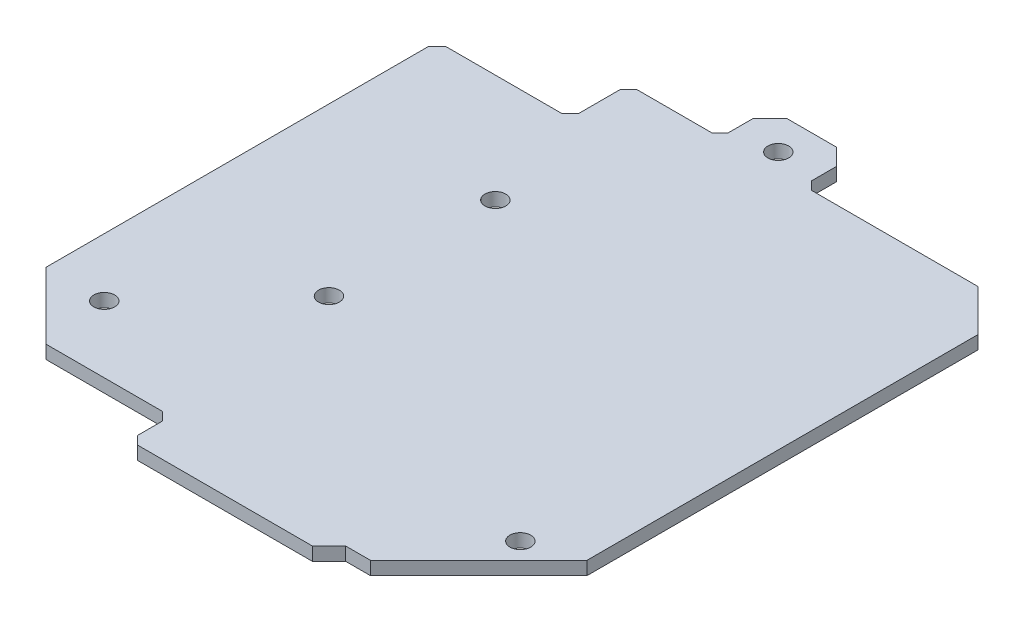
ISO-10303-21;
HEADER;
FILE_DESCRIPTION(('STEP AP214'),'2;1');
FILE_NAME('part.step','',(''),(''),'','','');
FILE_SCHEMA(('AUTOMOTIVE_DESIGN { 1 0 10303 214 1 1 1 1 }'));
ENDSEC;
DATA;
#1=APPLICATION_CONTEXT('core data for automotive mechanical design processes');
#2=APPLICATION_PROTOCOL_DEFINITION('international standard','automotive_design',2000,#1);
#3=PRODUCT_CONTEXT('',#1,'mechanical');
#4=PRODUCT('Part','Part','',(#3));
#5=PRODUCT_RELATED_PRODUCT_CATEGORY('part','',(#4));
#6=PRODUCT_DEFINITION_FORMATION('','',#4);
#7=PRODUCT_DEFINITION_CONTEXT('part definition',#1,'design');
#8=PRODUCT_DEFINITION('design','',#6,#7);
#9=PRODUCT_DEFINITION_SHAPE('','',#8);
#10=(LENGTH_UNIT() NAMED_UNIT(*) SI_UNIT(.MILLI.,.METRE.));
#11=(NAMED_UNIT(*) PLANE_ANGLE_UNIT() SI_UNIT($,.RADIAN.));
#12=(NAMED_UNIT(*) SI_UNIT($,.STERADIAN.) SOLID_ANGLE_UNIT());
#13=UNCERTAINTY_MEASURE_WITH_UNIT(LENGTH_MEASURE(1.E-05),#10,'distance_accuracy_value','');
#14=(GEOMETRIC_REPRESENTATION_CONTEXT(3) GLOBAL_UNCERTAINTY_ASSIGNED_CONTEXT((#13)) GLOBAL_UNIT_ASSIGNED_CONTEXT((#10,
#11,#12)) REPRESENTATION_CONTEXT('',''));
#15=CARTESIAN_POINT('',(0.,0.,0.));
#16=DIRECTION('',(0.,0.,1.));
#17=DIRECTION('',(1.,0.,0.));
#18=AXIS2_PLACEMENT_3D('',#15,#16,#17);
#19=CARTESIAN_POINT('',(0.,1.6,0.));
#20=DIRECTION('',(0.,1.,0.));
#21=DIRECTION('',(0.,0.,1.));
#22=AXIS2_PLACEMENT_3D('',#19,#20,#21);
#23=PLANE('',#22);
#24=CARTESIAN_POINT('',(-12.,1.6,-10.));
#25=DIRECTION('',(0.,1.,0.));
#26=DIRECTION('',(0.,0.,-1.));
#27=AXIS2_PLACEMENT_3D('',#24,#25,#26);
#28=CIRCLE('',#27,1.25);
#29=CARTESIAN_POINT('',(-12.,1.6,-11.25));
#30=VERTEX_POINT('',#29);
#31=EDGE_CURVE('E564',#30,#30,#28,.T.);
#32=ORIENTED_EDGE('',*,*,#31,.F.);
#33=EDGE_LOOP('',(#32));
#34=FACE_BOUND('',#33,.T.);
#35=CARTESIAN_POINT('',(25.,1.6,24.));
#36=DIRECTION('',(0.,1.,0.));
#37=DIRECTION('',(0.,0.,-1.));
#38=AXIS2_PLACEMENT_3D('',#35,#36,#37);
#39=CIRCLE('',#38,1.25);
#40=CARTESIAN_POINT('',(25.,1.6,22.75));
#41=VERTEX_POINT('',#40);
#42=EDGE_CURVE('E580',#41,#41,#39,.T.);
#43=ORIENTED_EDGE('',*,*,#42,.F.);
#44=EDGE_LOOP('',(#43));
#45=FACE_BOUND('',#44,.T.);
#46=DIRECTION('',(0.707106781186539,0.,0.707106781186556));
#47=VECTOR('',#46,1.);
#48=CARTESIAN_POINT('',(-32.,1.6,24.));
#49=LINE('',#48,#47);
#50=CARTESIAN_POINT('',(-32.,1.6,24.));
#51=VERTEX_POINT('',#50);
#52=CARTESIAN_POINT('',(-24.0000000000002,1.6,32.0000000000001));
#53=VERTEX_POINT('',#52);
#54=EDGE_CURVE('E330',#51,#53,#49,.T.);
#55=ORIENTED_EDGE('',*,*,#54,.T.);
#56=DIRECTION('',(1.,0.,0.));
#57=VECTOR('',#56,1.);
#58=CARTESIAN_POINT('',(-24.0000000000002,1.6,32.0000000000001));
#59=LINE('',#58,#57);
#60=CARTESIAN_POINT('',(-9.99999999999996,1.6,32.));
#61=VERTEX_POINT('',#60);
#62=EDGE_CURVE('E158',#53,#61,#59,.T.);
#63=ORIENTED_EDGE('',*,*,#62,.T.);
#64=DIRECTION('',(0.707106781186535,0.,0.70710678118656));
#65=VECTOR('',#64,1.);
#66=CARTESIAN_POINT('',(-9.99999999999996,1.6,32.));
#67=LINE('',#66,#65);
#68=CARTESIAN_POINT('',(-8.99999999999999,1.6,33.0000000000001));
#69=VERTEX_POINT('',#68);
#70=EDGE_CURVE('E423',#61,#69,#67,.T.);
#71=ORIENTED_EDGE('',*,*,#70,.T.);
#72=DIRECTION('',(0.,0.,1.));
#73=VECTOR('',#72,1.);
#74=CARTESIAN_POINT('',(-8.99999999999999,1.6,33.0000000000001));
#75=LINE('',#74,#73);
#76=CARTESIAN_POINT('',(-8.99999999999999,1.6,36.));
#77=VERTEX_POINT('',#76);
#78=EDGE_CURVE('E443',#69,#77,#75,.T.);
#79=ORIENTED_EDGE('',*,*,#78,.T.);
#80=DIRECTION('',(0.707106781186535,0.,0.70710678118656));
#81=VECTOR('',#80,1.);
#82=CARTESIAN_POINT('',(-8.99999999999999,1.6,36.));
#83=LINE('',#82,#81);
#84=CARTESIAN_POINT('',(-8.00000000000002,1.6,37.0000000000001));
#85=VERTEX_POINT('',#84);
#86=EDGE_CURVE('E439',#77,#85,#83,.T.);
#87=ORIENTED_EDGE('',*,*,#86,.T.);
#88=DIRECTION('',(1.,0.,0.));
#89=VECTOR('',#88,1.);
#90=CARTESIAN_POINT('',(-8.00000000000002,1.6,37.0000000000001));
#91=LINE('',#90,#89);
#92=CARTESIAN_POINT('',(13.,1.6,37.0000000000001));
#93=VERTEX_POINT('',#92);
#94=EDGE_CURVE('E442',#85,#93,#91,.T.);
#95=ORIENTED_EDGE('',*,*,#94,.T.);
#96=DIRECTION('',(0.707106781186556,0.,-0.707106781186539));
#97=VECTOR('',#96,1.);
#98=CARTESIAN_POINT('',(13.,1.6,37.0000000000001));
#99=LINE('',#98,#97);
#100=CARTESIAN_POINT('',(15.0000000000002,1.6,35.));
#101=VERTEX_POINT('',#100);
#102=EDGE_CURVE('E447',#93,#101,#99,.T.);
#103=ORIENTED_EDGE('',*,*,#102,.T.);
#104=DIRECTION('',(1.,0.,0.));
#105=VECTOR('',#104,1.);
#106=CARTESIAN_POINT('',(15.0000000000002,1.6,35.));
#107=LINE('',#106,#105);
#108=CARTESIAN_POINT('',(17.9999999999996,1.6,35.));
#109=VERTEX_POINT('',#108);
#110=EDGE_CURVE('E454',#101,#109,#107,.T.);
#111=ORIENTED_EDGE('',*,*,#110,.T.);
#112=DIRECTION('',(0.707106781186556,0.,-0.707106781186539));
#113=VECTOR('',#112,1.);
#114=CARTESIAN_POINT('',(17.9999999999996,1.6,35.));
#115=LINE('',#114,#113);
#116=CARTESIAN_POINT('',(30.9999999999999,1.6,22.));
#117=VERTEX_POINT('',#116);
#118=EDGE_CURVE('E457',#109,#117,#115,.T.);
#119=ORIENTED_EDGE('',*,*,#118,.T.);
#120=DIRECTION('',(0.,0.,-1.));
#121=VECTOR('',#120,1.);
#122=CARTESIAN_POINT('',(31.,1.6,-25.0000000000001));
#123=LINE('',#122,#121);
#124=CARTESIAN_POINT('',(31.,1.6,-25.0000000000001));
#125=VERTEX_POINT('',#124);
#126=EDGE_CURVE('E460',#117,#125,#123,.T.);
#127=ORIENTED_EDGE('',*,*,#126,.T.);
#128=DIRECTION('',(-0.707106781186553,0.,-0.707106781186542));
#129=VECTOR('',#128,1.);
#130=CARTESIAN_POINT('',(26.,1.6,-30.));
#131=LINE('',#130,#129);
#132=CARTESIAN_POINT('',(26.,1.6,-30.));
#133=VERTEX_POINT('',#132);
#134=EDGE_CURVE('E463',#125,#133,#131,.T.);
#135=ORIENTED_EDGE('',*,*,#134,.T.);
#136=DIRECTION('',(-1.,0.,0.));
#137=VECTOR('',#136,1.);
#138=CARTESIAN_POINT('',(6.,1.6,-30.));
#139=LINE('',#138,#137);
#140=CARTESIAN_POINT('',(6.,1.6,-30.));
#141=VERTEX_POINT('',#140);
#142=EDGE_CURVE('E466',#133,#141,#139,.T.);
#143=ORIENTED_EDGE('',*,*,#142,.T.);
#144=DIRECTION('',(-0.707106781186557,0.,-0.707106781186538));
#145=VECTOR('',#144,1.);
#146=CARTESIAN_POINT('',(5.,1.6,-31.));
#147=LINE('',#146,#145);
#148=CARTESIAN_POINT('',(5.,1.6,-31.));
#149=VERTEX_POINT('',#148);
#150=EDGE_CURVE('E469',#141,#149,#147,.T.);
#151=ORIENTED_EDGE('',*,*,#150,.T.);
#152=DIRECTION('',(0.,0.,-1.));
#153=VECTOR('',#152,1.);
#154=CARTESIAN_POINT('',(5.,1.6,-34.));
#155=LINE('',#154,#153);
#156=CARTESIAN_POINT('',(5.,1.6,-34.));
#157=VERTEX_POINT('',#156);
#158=EDGE_CURVE('E472',#149,#157,#155,.T.);
#159=ORIENTED_EDGE('',*,*,#158,.T.);
#160=DIRECTION('',(-0.70710678118655,0.,-0.707106781186545));
#161=VECTOR('',#160,1.);
#162=CARTESIAN_POINT('',(3.,1.6,-36.));
#163=LINE('',#162,#161);
#164=CARTESIAN_POINT('',(3.,1.6,-36.));
#165=VERTEX_POINT('',#164);
#166=EDGE_CURVE('E475',#157,#165,#163,.T.);
#167=ORIENTED_EDGE('',*,*,#166,.T.);
#168=DIRECTION('',(-1.,0.,0.));
#169=VECTOR('',#168,1.);
#170=CARTESIAN_POINT('',(-3.,1.6,-36.));
#171=LINE('',#170,#169);
#172=CARTESIAN_POINT('',(-3.,1.6,-36.));
#173=VERTEX_POINT('',#172);
#174=EDGE_CURVE('E478',#165,#173,#171,.T.);
#175=ORIENTED_EDGE('',*,*,#174,.T.);
#176=DIRECTION('',(-0.70710678118655,0.,0.707106781186545));
#177=VECTOR('',#176,1.);
#178=CARTESIAN_POINT('',(-3.,1.6,-36.));
#179=LINE('',#178,#177);
#180=CARTESIAN_POINT('',(-5.,1.6,-34.));
#181=VERTEX_POINT('',#180);
#182=EDGE_CURVE('E481',#173,#181,#179,.T.);
#183=ORIENTED_EDGE('',*,*,#182,.T.);
#184=DIRECTION('',(0.,0.,1.));
#185=VECTOR('',#184,1.);
#186=CARTESIAN_POINT('',(-5.,1.6,-34.));
#187=LINE('',#186,#185);
#188=CARTESIAN_POINT('',(-5.,1.6,-31.));
#189=VERTEX_POINT('',#188);
#190=EDGE_CURVE('E484',#181,#189,#187,.T.);
#191=ORIENTED_EDGE('',*,*,#190,.T.);
#192=DIRECTION('',(-0.707106781186556,0.,0.707106781186539));
#193=VECTOR('',#192,1.);
#194=CARTESIAN_POINT('',(-5.,1.6,-31.));
#195=LINE('',#194,#193);
#196=CARTESIAN_POINT('',(-6.,1.6,-30.));
#197=VERTEX_POINT('',#196);
#198=EDGE_CURVE('E487',#189,#197,#195,.T.);
#199=ORIENTED_EDGE('',*,*,#198,.T.);
#200=DIRECTION('',(-1.,0.,0.));
#201=VECTOR('',#200,1.);
#202=CARTESIAN_POINT('',(-6.,1.6,-30.));
#203=LINE('',#202,#201);
#204=CARTESIAN_POINT('',(-15.,1.6,-30.));
#205=VERTEX_POINT('',#204);
#206=EDGE_CURVE('E490',#197,#205,#203,.T.);
#207=ORIENTED_EDGE('',*,*,#206,.T.);
#208=DIRECTION('',(-0.707106781186556,0.,0.707106781186539));
#209=VECTOR('',#208,1.);
#210=CARTESIAN_POINT('',(-15.,1.6,-30.));
#211=LINE('',#210,#209);
#212=CARTESIAN_POINT('',(-16.,1.6,-29.));
#213=VERTEX_POINT('',#212);
#214=EDGE_CURVE('E493',#205,#213,#211,.T.);
#215=ORIENTED_EDGE('',*,*,#214,.T.);
#216=DIRECTION('',(0.,0.,1.));
#217=VECTOR('',#216,1.);
#218=CARTESIAN_POINT('',(-16.,1.6,-29.));
#219=LINE('',#218,#217);
#220=CARTESIAN_POINT('',(-16.,1.6,-24.));
#221=VERTEX_POINT('',#220);
#222=EDGE_CURVE('E496',#213,#221,#219,.T.);
#223=ORIENTED_EDGE('',*,*,#222,.T.);
#224=DIRECTION('',(-0.707106781186555,0.,0.70710678118654));
#225=VECTOR('',#224,1.);
#226=CARTESIAN_POINT('',(-16.,1.6,-24.));
#227=LINE('',#226,#225);
#228=CARTESIAN_POINT('',(-17.,1.6,-23.));
#229=VERTEX_POINT('',#228);
#230=EDGE_CURVE('E231',#221,#229,#227,.T.);
#231=ORIENTED_EDGE('',*,*,#230,.T.);
#232=DIRECTION('',(-1.,0.,0.));
#233=VECTOR('',#232,1.);
#234=CARTESIAN_POINT('',(-17.,1.6,-23.));
#235=LINE('',#234,#233);
#236=CARTESIAN_POINT('',(-31.,1.6,-22.9999999999999));
#237=VERTEX_POINT('',#236);
#238=EDGE_CURVE('E225',#229,#237,#235,.T.);
#239=ORIENTED_EDGE('',*,*,#238,.T.);
#240=DIRECTION('',(-0.707106781186556,0.,0.707106781186539));
#241=VECTOR('',#240,1.);
#242=CARTESIAN_POINT('',(-31.,1.6,-22.9999999999999));
#243=LINE('',#242,#241);
#244=CARTESIAN_POINT('',(-32.,1.6,-22.));
#245=VERTEX_POINT('',#244);
#246=EDGE_CURVE('E229',#237,#245,#243,.T.);
#247=ORIENTED_EDGE('',*,*,#246,.T.);
#248=DIRECTION('',(0.,0.,1.));
#249=VECTOR('',#248,1.);
#250=CARTESIAN_POINT('',(-32.,1.6,24.));
#251=LINE('',#250,#249);
#252=EDGE_CURVE('E61',#245,#51,#251,.T.);
#253=ORIENTED_EDGE('',*,*,#252,.T.);
#254=EDGE_LOOP('',(#55,#63,#71,#79,#87,#95,#103,#111,#119,#127,#135,#143,#151,#159,#167,#175,
#183,#191,#199,#207,#215,#223,#231,#239,#247,#253));
#255=FACE_BOUND('',#254,.T.);
#256=CARTESIAN_POINT('',(-25.,1.6,24.));
#257=DIRECTION('',(0.,1.,0.));
#258=DIRECTION('',(0.,0.,1.));
#259=AXIS2_PLACEMENT_3D('',#256,#257,#258);
#260=CIRCLE('',#259,1.25);
#261=CARTESIAN_POINT('',(-25.,1.6,25.25));
#262=VERTEX_POINT('',#261);
#263=EDGE_CURVE('E258',#262,#262,#260,.T.);
#264=ORIENTED_EDGE('',*,*,#263,.F.);
#265=EDGE_LOOP('',(#264));
#266=FACE_BOUND('',#265,.T.);
#267=CARTESIAN_POINT('',(0.,1.6,-32.));
#268=DIRECTION('',(0.,1.,0.));
#269=DIRECTION('',(0.,0.,1.));
#270=AXIS2_PLACEMENT_3D('',#267,#268,#269);
#271=CIRCLE('',#270,1.25);
#272=CARTESIAN_POINT('',(0.,1.6,-30.75));
#273=VERTEX_POINT('',#272);
#274=EDGE_CURVE('E572',#273,#273,#271,.T.);
#275=ORIENTED_EDGE('',*,*,#274,.F.);
#276=EDGE_LOOP('',(#275));
#277=FACE_BOUND('',#276,.T.);
#278=CARTESIAN_POINT('',(-12.,1.6,10.));
#279=DIRECTION('',(0.,1.,0.));
#280=DIRECTION('',(0.,0.,1.));
#281=AXIS2_PLACEMENT_3D('',#278,#279,#280);
#282=CIRCLE('',#281,1.25);
#283=CARTESIAN_POINT('',(-12.,1.6,11.25));
#284=VERTEX_POINT('',#283);
#285=EDGE_CURVE('E553',#284,#284,#282,.T.);
#286=ORIENTED_EDGE('',*,*,#285,.F.);
#287=EDGE_LOOP('',(#286));
#288=FACE_BOUND('',#287,.T.);
#289=ADVANCED_FACE('F43',(#34,#45,#255,#266,#277,#288),#23,.T.);
#290=CARTESIAN_POINT('',(0.,0.,0.));
#291=DIRECTION('',(0.,1.,0.));
#292=DIRECTION('',(0.,0.,1.));
#293=AXIS2_PLACEMENT_3D('',#290,#291,#292);
#294=PLANE('',#293);
#295=DIRECTION('',(0.707106781186539,0.,0.707106781186556));
#296=VECTOR('',#295,1.);
#297=CARTESIAN_POINT('',(-32.,0.,24.));
#298=LINE('',#297,#296);
#299=CARTESIAN_POINT('',(-32.,0.,24.));
#300=VERTEX_POINT('',#299);
#301=CARTESIAN_POINT('',(-24.0000000000002,0.,32.0000000000001));
#302=VERTEX_POINT('',#301);
#303=EDGE_CURVE('E253',#300,#302,#298,.T.);
#304=ORIENTED_EDGE('',*,*,#303,.F.);
#305=DIRECTION('',(0.,0.,1.));
#306=VECTOR('',#305,1.);
#307=CARTESIAN_POINT('',(-32.,0.,24.));
#308=LINE('',#307,#306);
#309=CARTESIAN_POINT('',(-32.,0.,-22.));
#310=VERTEX_POINT('',#309);
#311=EDGE_CURVE('E150',#310,#300,#308,.T.);
#312=ORIENTED_EDGE('',*,*,#311,.F.);
#313=DIRECTION('',(-0.707106781186556,0.,0.707106781186539));
#314=VECTOR('',#313,1.);
#315=CARTESIAN_POINT('',(-31.,0.,-22.9999999999999));
#316=LINE('',#315,#314);
#317=CARTESIAN_POINT('',(-31.,0.,-22.9999999999999));
#318=VERTEX_POINT('',#317);
#319=EDGE_CURVE('E144',#318,#310,#316,.T.);
#320=ORIENTED_EDGE('',*,*,#319,.F.);
#321=DIRECTION('',(-1.,0.,0.));
#322=VECTOR('',#321,1.);
#323=CARTESIAN_POINT('',(-17.,0.,-23.));
#324=LINE('',#323,#322);
#325=CARTESIAN_POINT('',(-17.,0.,-23.));
#326=VERTEX_POINT('',#325);
#327=EDGE_CURVE('E240',#326,#318,#324,.T.);
#328=ORIENTED_EDGE('',*,*,#327,.F.);
#329=DIRECTION('',(-0.707106781186555,0.,0.70710678118654));
#330=VECTOR('',#329,1.);
#331=CARTESIAN_POINT('',(-16.,0.,-24.));
#332=LINE('',#331,#330);
#333=CARTESIAN_POINT('',(-16.,0.,-24.));
#334=VERTEX_POINT('',#333);
#335=EDGE_CURVE('E321',#334,#326,#332,.T.);
#336=ORIENTED_EDGE('',*,*,#335,.F.);
#337=DIRECTION('',(0.,0.,1.));
#338=VECTOR('',#337,1.);
#339=CARTESIAN_POINT('',(-16.,0.,-29.));
#340=LINE('',#339,#338);
#341=CARTESIAN_POINT('',(-16.,0.,-29.));
#342=VERTEX_POINT('',#341);
#343=EDGE_CURVE('E318',#342,#334,#340,.T.);
#344=ORIENTED_EDGE('',*,*,#343,.F.);
#345=DIRECTION('',(-0.707106781186556,0.,0.707106781186539));
#346=VECTOR('',#345,1.);
#347=CARTESIAN_POINT('',(-15.,0.,-30.));
#348=LINE('',#347,#346);
#349=CARTESIAN_POINT('',(-15.,0.,-30.));
#350=VERTEX_POINT('',#349);
#351=EDGE_CURVE('E315',#350,#342,#348,.T.);
#352=ORIENTED_EDGE('',*,*,#351,.F.);
#353=DIRECTION('',(-1.,0.,0.));
#354=VECTOR('',#353,1.);
#355=CARTESIAN_POINT('',(-6.,0.,-30.));
#356=LINE('',#355,#354);
#357=CARTESIAN_POINT('',(-6.,0.,-30.));
#358=VERTEX_POINT('',#357);
#359=EDGE_CURVE('E312',#358,#350,#356,.T.);
#360=ORIENTED_EDGE('',*,*,#359,.F.);
#361=DIRECTION('',(-0.707106781186556,0.,0.707106781186539));
#362=VECTOR('',#361,1.);
#363=CARTESIAN_POINT('',(-5.,0.,-31.));
#364=LINE('',#363,#362);
#365=CARTESIAN_POINT('',(-5.,0.,-31.));
#366=VERTEX_POINT('',#365);
#367=EDGE_CURVE('E309',#366,#358,#364,.T.);
#368=ORIENTED_EDGE('',*,*,#367,.F.);
#369=DIRECTION('',(0.,0.,1.));
#370=VECTOR('',#369,1.);
#371=CARTESIAN_POINT('',(-5.,0.,-34.));
#372=LINE('',#371,#370);
#373=CARTESIAN_POINT('',(-5.,0.,-34.));
#374=VERTEX_POINT('',#373);
#375=EDGE_CURVE('E306',#374,#366,#372,.T.);
#376=ORIENTED_EDGE('',*,*,#375,.F.);
#377=DIRECTION('',(-0.70710678118655,0.,0.707106781186545));
#378=VECTOR('',#377,1.);
#379=CARTESIAN_POINT('',(-3.,0.,-36.));
#380=LINE('',#379,#378);
#381=CARTESIAN_POINT('',(-3.,0.,-36.));
#382=VERTEX_POINT('',#381);
#383=EDGE_CURVE('E303',#382,#374,#380,.T.);
#384=ORIENTED_EDGE('',*,*,#383,.F.);
#385=DIRECTION('',(-1.,0.,0.));
#386=VECTOR('',#385,1.);
#387=CARTESIAN_POINT('',(-3.,0.,-36.));
#388=LINE('',#387,#386);
#389=CARTESIAN_POINT('',(3.,0.,-36.));
#390=VERTEX_POINT('',#389);
#391=EDGE_CURVE('E300',#390,#382,#388,.T.);
#392=ORIENTED_EDGE('',*,*,#391,.F.);
#393=DIRECTION('',(-0.70710678118655,0.,-0.707106781186545));
#394=VECTOR('',#393,1.);
#395=CARTESIAN_POINT('',(3.,0.,-36.));
#396=LINE('',#395,#394);
#397=CARTESIAN_POINT('',(5.,0.,-34.));
#398=VERTEX_POINT('',#397);
#399=EDGE_CURVE('E297',#398,#390,#396,.T.);
#400=ORIENTED_EDGE('',*,*,#399,.F.);
#401=DIRECTION('',(0.,0.,-1.));
#402=VECTOR('',#401,1.);
#403=CARTESIAN_POINT('',(5.,0.,-34.));
#404=LINE('',#403,#402);
#405=CARTESIAN_POINT('',(5.,0.,-31.));
#406=VERTEX_POINT('',#405);
#407=EDGE_CURVE('E294',#406,#398,#404,.T.);
#408=ORIENTED_EDGE('',*,*,#407,.F.);
#409=DIRECTION('',(-0.707106781186557,0.,-0.707106781186538));
#410=VECTOR('',#409,1.);
#411=CARTESIAN_POINT('',(5.,0.,-31.));
#412=LINE('',#411,#410);
#413=CARTESIAN_POINT('',(6.,0.,-30.));
#414=VERTEX_POINT('',#413);
#415=EDGE_CURVE('E291',#414,#406,#412,.T.);
#416=ORIENTED_EDGE('',*,*,#415,.F.);
#417=DIRECTION('',(-1.,0.,0.));
#418=VECTOR('',#417,1.);
#419=CARTESIAN_POINT('',(6.,0.,-30.));
#420=LINE('',#419,#418);
#421=CARTESIAN_POINT('',(26.,0.,-30.));
#422=VERTEX_POINT('',#421);
#423=EDGE_CURVE('E288',#422,#414,#420,.T.);
#424=ORIENTED_EDGE('',*,*,#423,.F.);
#425=DIRECTION('',(-0.707106781186553,0.,-0.707106781186542));
#426=VECTOR('',#425,1.);
#427=CARTESIAN_POINT('',(26.,0.,-30.));
#428=LINE('',#427,#426);
#429=CARTESIAN_POINT('',(31.,0.,-25.0000000000001));
#430=VERTEX_POINT('',#429);
#431=EDGE_CURVE('E285',#430,#422,#428,.T.);
#432=ORIENTED_EDGE('',*,*,#431,.F.);
#433=DIRECTION('',(0.,0.,-1.));
#434=VECTOR('',#433,1.);
#435=CARTESIAN_POINT('',(31.,0.,-25.0000000000001));
#436=LINE('',#435,#434);
#437=CARTESIAN_POINT('',(30.9999999999999,0.,22.));
#438=VERTEX_POINT('',#437);
#439=EDGE_CURVE('E282',#438,#430,#436,.T.);
#440=ORIENTED_EDGE('',*,*,#439,.F.);
#441=DIRECTION('',(0.707106781186556,0.,-0.707106781186539));
#442=VECTOR('',#441,1.);
#443=CARTESIAN_POINT('',(17.9999999999996,0.,35.));
#444=LINE('',#443,#442);
#445=CARTESIAN_POINT('',(17.9999999999996,0.,35.));
#446=VERTEX_POINT('',#445);
#447=EDGE_CURVE('E279',#446,#438,#444,.T.);
#448=ORIENTED_EDGE('',*,*,#447,.F.);
#449=DIRECTION('',(1.,0.,0.));
#450=VECTOR('',#449,1.);
#451=CARTESIAN_POINT('',(15.0000000000002,0.,35.));
#452=LINE('',#451,#450);
#453=CARTESIAN_POINT('',(15.0000000000002,0.,35.));
#454=VERTEX_POINT('',#453);
#455=EDGE_CURVE('E276',#454,#446,#452,.T.);
#456=ORIENTED_EDGE('',*,*,#455,.F.);
#457=DIRECTION('',(0.707106781186556,0.,-0.707106781186539));
#458=VECTOR('',#457,1.);
#459=CARTESIAN_POINT('',(13.,0.,37.0000000000001));
#460=LINE('',#459,#458);
#461=CARTESIAN_POINT('',(13.,0.,37.0000000000001));
#462=VERTEX_POINT('',#461);
#463=EDGE_CURVE('E273',#462,#454,#460,.T.);
#464=ORIENTED_EDGE('',*,*,#463,.F.);
#465=DIRECTION('',(1.,0.,0.));
#466=VECTOR('',#465,1.);
#467=CARTESIAN_POINT('',(-8.00000000000002,0.,37.0000000000001));
#468=LINE('',#467,#466);
#469=CARTESIAN_POINT('',(-8.00000000000002,0.,37.0000000000001));
#470=VERTEX_POINT('',#469);
#471=EDGE_CURVE('E270',#470,#462,#468,.T.);
#472=ORIENTED_EDGE('',*,*,#471,.F.);
#473=DIRECTION('',(0.707106781186535,0.,0.70710678118656));
#474=VECTOR('',#473,1.);
#475=CARTESIAN_POINT('',(-8.99999999999999,0.,36.));
#476=LINE('',#475,#474);
#477=CARTESIAN_POINT('',(-8.99999999999999,0.,36.));
#478=VERTEX_POINT('',#477);
#479=EDGE_CURVE('E267',#478,#470,#476,.T.);
#480=ORIENTED_EDGE('',*,*,#479,.F.);
#481=DIRECTION('',(0.,0.,1.));
#482=VECTOR('',#481,1.);
#483=CARTESIAN_POINT('',(-8.99999999999999,0.,33.0000000000001));
#484=LINE('',#483,#482);
#485=CARTESIAN_POINT('',(-8.99999999999999,0.,33.0000000000001));
#486=VERTEX_POINT('',#485);
#487=EDGE_CURVE('E264',#486,#478,#484,.T.);
#488=ORIENTED_EDGE('',*,*,#487,.F.);
#489=DIRECTION('',(0.707106781186535,0.,0.70710678118656));
#490=VECTOR('',#489,1.);
#491=CARTESIAN_POINT('',(-9.99999999999996,0.,32.));
#492=LINE('',#491,#490);
#493=CARTESIAN_POINT('',(-9.99999999999996,0.,32.));
#494=VERTEX_POINT('',#493);
#495=EDGE_CURVE('E261',#494,#486,#492,.T.);
#496=ORIENTED_EDGE('',*,*,#495,.F.);
#497=DIRECTION('',(1.,0.,0.));
#498=VECTOR('',#497,1.);
#499=CARTESIAN_POINT('',(-24.0000000000002,0.,32.0000000000001));
#500=LINE('',#499,#498);
#501=EDGE_CURVE('E257',#302,#494,#500,.T.);
#502=ORIENTED_EDGE('',*,*,#501,.F.);
#503=EDGE_LOOP('',(#304,#312,#320,#328,#336,#344,#352,#360,#368,#376,#384,#392,#400,#408,#416,
#424,#432,#440,#448,#456,#464,#472,#480,#488,#496,#502));
#504=FACE_BOUND('',#503,.T.);
#505=CARTESIAN_POINT('',(-25.,0.,24.));
#506=DIRECTION('',(0.,1.,0.));
#507=DIRECTION('',(0.,0.,1.));
#508=AXIS2_PLACEMENT_3D('',#505,#506,#507);
#509=CIRCLE('',#508,1.25);
#510=CARTESIAN_POINT('',(-25.,0.,25.25));
#511=VERTEX_POINT('',#510);
#512=EDGE_CURVE('E584',#511,#511,#509,.T.);
#513=ORIENTED_EDGE('',*,*,#512,.T.);
#514=EDGE_LOOP('',(#513));
#515=FACE_BOUND('',#514,.T.);
#516=CARTESIAN_POINT('',(25.,0.,24.));
#517=DIRECTION('',(0.,1.,0.));
#518=DIRECTION('',(0.,0.,-1.));
#519=AXIS2_PLACEMENT_3D('',#516,#517,#518);
#520=CIRCLE('',#519,1.25);
#521=CARTESIAN_POINT('',(25.,0.,22.75));
#522=VERTEX_POINT('',#521);
#523=EDGE_CURVE('E576',#522,#522,#520,.T.);
#524=ORIENTED_EDGE('',*,*,#523,.T.);
#525=EDGE_LOOP('',(#524));
#526=FACE_BOUND('',#525,.T.);
#527=CARTESIAN_POINT('',(0.,0.,-32.));
#528=DIRECTION('',(0.,1.,0.));
#529=DIRECTION('',(0.,0.,1.));
#530=AXIS2_PLACEMENT_3D('',#527,#528,#529);
#531=CIRCLE('',#530,1.25);
#532=CARTESIAN_POINT('',(0.,0.,-30.75));
#533=VERTEX_POINT('',#532);
#534=EDGE_CURVE('E568',#533,#533,#531,.T.);
#535=ORIENTED_EDGE('',*,*,#534,.T.);
#536=EDGE_LOOP('',(#535));
#537=FACE_BOUND('',#536,.T.);
#538=CARTESIAN_POINT('',(-12.,0.,-10.));
#539=DIRECTION('',(0.,1.,0.));
#540=DIRECTION('',(0.,0.,-1.));
#541=AXIS2_PLACEMENT_3D('',#538,#539,#540);
#542=CIRCLE('',#541,1.25);
#543=CARTESIAN_POINT('',(-12.,0.,-11.25));
#544=VERTEX_POINT('',#543);
#545=EDGE_CURVE('E561',#544,#544,#542,.T.);
#546=ORIENTED_EDGE('',*,*,#545,.T.);
#547=EDGE_LOOP('',(#546));
#548=FACE_BOUND('',#547,.T.);
#549=CARTESIAN_POINT('',(-12.,0.,10.));
#550=DIRECTION('',(0.,1.,0.));
#551=DIRECTION('',(0.,0.,1.));
#552=AXIS2_PLACEMENT_3D('',#549,#550,#551);
#553=CIRCLE('',#552,1.25);
#554=CARTESIAN_POINT('',(-12.,0.,11.25));
#555=VERTEX_POINT('',#554);
#556=EDGE_CURVE('E556',#555,#555,#553,.T.);
#557=ORIENTED_EDGE('',*,*,#556,.T.);
#558=EDGE_LOOP('',(#557));
#559=FACE_BOUND('',#558,.T.);
#560=ADVANCED_FACE('F427',(#504,#515,#526,#537,#548,#559),#294,.F.);
#561=CARTESIAN_POINT('',(-32.,1.6,24.));
#562=DIRECTION('',(0.707106781186556,0.,-0.707106781186539));
#563=DIRECTION('',(-0.707106781186539,0.,-0.707106781186556));
#564=AXIS2_PLACEMENT_3D('',#561,#562,#563);
#565=PLANE('',#564);
#566=ORIENTED_EDGE('',*,*,#303,.T.);
#567=DIRECTION('',(0.,-1.,0.));
#568=VECTOR('',#567,1.);
#569=CARTESIAN_POINT('',(-24.0000000000002,1.6,32.0000000000001));
#570=LINE('',#569,#568);
#571=EDGE_CURVE('E11',#53,#302,#570,.T.);
#572=ORIENTED_EDGE('',*,*,#571,.F.);
#573=ORIENTED_EDGE('',*,*,#54,.F.);
#574=DIRECTION('',(0.,-1.,0.));
#575=VECTOR('',#574,1.);
#576=CARTESIAN_POINT('',(-32.,1.6,24.));
#577=LINE('',#576,#575);
#578=EDGE_CURVE('E249',#51,#300,#577,.T.);
#579=ORIENTED_EDGE('',*,*,#578,.T.);
#580=EDGE_LOOP('',(#566,#572,#573,#579));
#581=FACE_BOUND('',#580,.T.);
#582=ADVANCED_FACE('F45',(#581),#565,.F.);
#583=CARTESIAN_POINT('',(-24.0000000000002,1.6,32.0000000000001));
#584=DIRECTION('',(0.,0.,-1.));
#585=DIRECTION('',(-1.,0.,0.));
#586=AXIS2_PLACEMENT_3D('',#583,#584,#585);
#587=PLANE('',#586);
#588=ORIENTED_EDGE('',*,*,#501,.T.);
#589=DIRECTION('',(0.,-1.,0.));
#590=VECTOR('',#589,1.);
#591=CARTESIAN_POINT('',(-9.99999999999996,1.6,32.));
#592=LINE('',#591,#590);
#593=EDGE_CURVE('E53',#61,#494,#592,.T.);
#594=ORIENTED_EDGE('',*,*,#593,.F.);
#595=ORIENTED_EDGE('',*,*,#62,.F.);
#596=ORIENTED_EDGE('',*,*,#571,.T.);
#597=EDGE_LOOP('',(#588,#594,#595,#596));
#598=FACE_BOUND('',#597,.T.);
#599=ADVANCED_FACE('F873',(#598),#587,.F.);
#600=CARTESIAN_POINT('',(-9.99999999999996,1.6,32.));
#601=DIRECTION('',(0.70710678118656,0.,-0.707106781186535));
#602=DIRECTION('',(-0.707106781186535,0.,-0.70710678118656));
#603=AXIS2_PLACEMENT_3D('',#600,#601,#602);
#604=PLANE('',#603);
#605=ORIENTED_EDGE('',*,*,#495,.T.);
#606=DIRECTION('',(0.,-1.,0.));
#607=VECTOR('',#606,1.);
#608=CARTESIAN_POINT('',(-8.99999999999999,1.6,33.0000000000001));
#609=LINE('',#608,#607);
#610=EDGE_CURVE('E413',#69,#486,#609,.T.);
#611=ORIENTED_EDGE('',*,*,#610,.F.);
#612=ORIENTED_EDGE('',*,*,#70,.F.);
#613=ORIENTED_EDGE('',*,*,#593,.T.);
#614=EDGE_LOOP('',(#605,#611,#612,#613));
#615=FACE_BOUND('',#614,.T.);
#616=ADVANCED_FACE('F421',(#615),#604,.F.);
#617=CARTESIAN_POINT('',(-8.99999999999999,1.6,33.0000000000001));
#618=DIRECTION('',(1.,0.,0.));
#619=DIRECTION('',(0.,0.,-1.));
#620=AXIS2_PLACEMENT_3D('',#617,#618,#619);
#621=PLANE('',#620);
#622=ORIENTED_EDGE('',*,*,#487,.T.);
#623=DIRECTION('',(0.,-1.,0.));
#624=VECTOR('',#623,1.);
#625=CARTESIAN_POINT('',(-8.99999999999999,1.6,36.));
#626=LINE('',#625,#624);
#627=EDGE_CURVE('E409',#77,#478,#626,.T.);
#628=ORIENTED_EDGE('',*,*,#627,.F.);
#629=ORIENTED_EDGE('',*,*,#78,.F.);
#630=ORIENTED_EDGE('',*,*,#610,.T.);
#631=EDGE_LOOP('',(#622,#628,#629,#630));
#632=FACE_BOUND('',#631,.T.);
#633=ADVANCED_FACE('F433',(#632),#621,.F.);
#634=CARTESIAN_POINT('',(-8.99999999999999,1.6,36.));
#635=DIRECTION('',(0.70710678118656,0.,-0.707106781186535));
#636=DIRECTION('',(-0.707106781186535,0.,-0.70710678118656));
#637=AXIS2_PLACEMENT_3D('',#634,#635,#636);
#638=PLANE('',#637);
#639=ORIENTED_EDGE('',*,*,#479,.T.);
#640=DIRECTION('',(0.,-1.,0.));
#641=VECTOR('',#640,1.);
#642=CARTESIAN_POINT('',(-8.00000000000002,1.6,37.0000000000001));
#643=LINE('',#642,#641);
#644=EDGE_CURVE('E405',#85,#470,#643,.T.);
#645=ORIENTED_EDGE('',*,*,#644,.F.);
#646=ORIENTED_EDGE('',*,*,#86,.F.);
#647=ORIENTED_EDGE('',*,*,#627,.T.);
#648=EDGE_LOOP('',(#639,#645,#646,#647));
#649=FACE_BOUND('',#648,.T.);
#650=ADVANCED_FACE('F437',(#649),#638,.F.);
#651=CARTESIAN_POINT('',(-8.00000000000002,1.6,37.0000000000001));
#652=DIRECTION('',(0.,0.,-1.));
#653=DIRECTION('',(-1.,0.,0.));
#654=AXIS2_PLACEMENT_3D('',#651,#652,#653);
#655=PLANE('',#654);
#656=ORIENTED_EDGE('',*,*,#471,.T.);
#657=DIRECTION('',(0.,-1.,0.));
#658=VECTOR('',#657,1.);
#659=CARTESIAN_POINT('',(13.,1.6,37.0000000000001));
#660=LINE('',#659,#658);
#661=EDGE_CURVE('E401',#93,#462,#660,.T.);
#662=ORIENTED_EDGE('',*,*,#661,.F.);
#663=ORIENTED_EDGE('',*,*,#94,.F.);
#664=ORIENTED_EDGE('',*,*,#644,.T.);
#665=EDGE_LOOP('',(#656,#662,#663,#664));
#666=FACE_BOUND('',#665,.T.);
#667=ADVANCED_FACE('F834',(#666),#655,.F.);
#668=CARTESIAN_POINT('',(13.,1.6,37.0000000000001));
#669=DIRECTION('',(-0.707106781186539,0.,-0.707106781186556));
#670=DIRECTION('',(-0.707106781186556,0.,0.707106781186539));
#671=AXIS2_PLACEMENT_3D('',#668,#669,#670);
#672=PLANE('',#671);
#673=ORIENTED_EDGE('',*,*,#463,.T.);
#674=DIRECTION('',(0.,-1.,0.));
#675=VECTOR('',#674,1.);
#676=CARTESIAN_POINT('',(15.0000000000002,1.6,35.));
#677=LINE('',#676,#675);
#678=EDGE_CURVE('E397',#101,#454,#677,.T.);
#679=ORIENTED_EDGE('',*,*,#678,.F.);
#680=ORIENTED_EDGE('',*,*,#102,.F.);
#681=ORIENTED_EDGE('',*,*,#661,.T.);
#682=EDGE_LOOP('',(#673,#679,#680,#681));
#683=FACE_BOUND('',#682,.T.);
#684=ADVANCED_FACE('F823',(#683),#672,.F.);
#685=CARTESIAN_POINT('',(15.0000000000002,1.6,35.));
#686=DIRECTION('',(0.,0.,-1.));
#687=DIRECTION('',(-1.,0.,0.));
#688=AXIS2_PLACEMENT_3D('',#685,#686,#687);
#689=PLANE('',#688);
#690=ORIENTED_EDGE('',*,*,#455,.T.);
#691=DIRECTION('',(0.,-1.,0.));
#692=VECTOR('',#691,1.);
#693=CARTESIAN_POINT('',(17.9999999999996,1.6,35.));
#694=LINE('',#693,#692);
#695=EDGE_CURVE('E393',#109,#446,#694,.T.);
#696=ORIENTED_EDGE('',*,*,#695,.F.);
#697=ORIENTED_EDGE('',*,*,#110,.F.);
#698=ORIENTED_EDGE('',*,*,#678,.T.);
#699=EDGE_LOOP('',(#690,#696,#697,#698));
#700=FACE_BOUND('',#699,.T.);
#701=ADVANCED_FACE('F812',(#700),#689,.F.);
#702=CARTESIAN_POINT('',(17.9999999999996,1.6,35.));
#703=DIRECTION('',(-0.707106781186539,0.,-0.707106781186556));
#704=DIRECTION('',(-0.707106781186556,0.,0.707106781186539));
#705=AXIS2_PLACEMENT_3D('',#702,#703,#704);
#706=PLANE('',#705);
#707=ORIENTED_EDGE('',*,*,#447,.T.);
#708=DIRECTION('',(0.,-1.,0.));
#709=VECTOR('',#708,1.);
#710=CARTESIAN_POINT('',(30.9999999999999,1.6,22.));
#711=LINE('',#710,#709);
#712=EDGE_CURVE('E389',#117,#438,#711,.T.);
#713=ORIENTED_EDGE('',*,*,#712,.F.);
#714=ORIENTED_EDGE('',*,*,#118,.F.);
#715=ORIENTED_EDGE('',*,*,#695,.T.);
#716=EDGE_LOOP('',(#707,#713,#714,#715));
#717=FACE_BOUND('',#716,.T.);
#718=ADVANCED_FACE('F801',(#717),#706,.F.);
#719=CARTESIAN_POINT('',(31.,1.6,-25.0000000000001));
#720=DIRECTION('',(-1.,0.,0.));
#721=DIRECTION('',(0.,0.,1.));
#722=AXIS2_PLACEMENT_3D('',#719,#720,#721);
#723=PLANE('',#722);
#724=ORIENTED_EDGE('',*,*,#439,.T.);
#725=DIRECTION('',(0.,-1.,0.));
#726=VECTOR('',#725,1.);
#727=CARTESIAN_POINT('',(31.,1.6,-25.0000000000001));
#728=LINE('',#727,#726);
#729=EDGE_CURVE('E385',#125,#430,#728,.T.);
#730=ORIENTED_EDGE('',*,*,#729,.F.);
#731=ORIENTED_EDGE('',*,*,#126,.F.);
#732=ORIENTED_EDGE('',*,*,#712,.T.);
#733=EDGE_LOOP('',(#724,#730,#731,#732));
#734=FACE_BOUND('',#733,.T.);
#735=ADVANCED_FACE('F790',(#734),#723,.F.);
#736=CARTESIAN_POINT('',(26.,1.6,-30.));
#737=DIRECTION('',(-0.707106781186542,0.,0.707106781186553));
#738=DIRECTION('',(0.707106781186553,0.,0.707106781186542));
#739=AXIS2_PLACEMENT_3D('',#736,#737,#738);
#740=PLANE('',#739);
#741=ORIENTED_EDGE('',*,*,#431,.T.);
#742=DIRECTION('',(0.,-1.,0.));
#743=VECTOR('',#742,1.);
#744=CARTESIAN_POINT('',(26.,1.6,-30.));
#745=LINE('',#744,#743);
#746=EDGE_CURVE('E381',#133,#422,#745,.T.);
#747=ORIENTED_EDGE('',*,*,#746,.F.);
#748=ORIENTED_EDGE('',*,*,#134,.F.);
#749=ORIENTED_EDGE('',*,*,#729,.T.);
#750=EDGE_LOOP('',(#741,#747,#748,#749));
#751=FACE_BOUND('',#750,.T.);
#752=ADVANCED_FACE('F779',(#751),#740,.F.);
#753=CARTESIAN_POINT('',(6.,1.6,-30.));
#754=DIRECTION('',(0.,0.,1.));
#755=DIRECTION('',(1.,0.,0.));
#756=AXIS2_PLACEMENT_3D('',#753,#754,#755);
#757=PLANE('',#756);
#758=ORIENTED_EDGE('',*,*,#423,.T.);
#759=DIRECTION('',(0.,-1.,0.));
#760=VECTOR('',#759,1.);
#761=CARTESIAN_POINT('',(6.,1.6,-30.));
#762=LINE('',#761,#760);
#763=EDGE_CURVE('E377',#141,#414,#762,.T.);
#764=ORIENTED_EDGE('',*,*,#763,.F.);
#765=ORIENTED_EDGE('',*,*,#142,.F.);
#766=ORIENTED_EDGE('',*,*,#746,.T.);
#767=EDGE_LOOP('',(#758,#764,#765,#766));
#768=FACE_BOUND('',#767,.T.);
#769=ADVANCED_FACE('F768',(#768),#757,.F.);
#770=CARTESIAN_POINT('',(5.,1.6,-31.));
#771=DIRECTION('',(-0.707106781186538,0.,0.707106781186557));
#772=DIRECTION('',(0.707106781186557,0.,0.707106781186538));
#773=AXIS2_PLACEMENT_3D('',#770,#771,#772);
#774=PLANE('',#773);
#775=ORIENTED_EDGE('',*,*,#415,.T.);
#776=DIRECTION('',(0.,-1.,0.));
#777=VECTOR('',#776,1.);
#778=CARTESIAN_POINT('',(5.,1.6,-31.));
#779=LINE('',#778,#777);
#780=EDGE_CURVE('E373',#149,#406,#779,.T.);
#781=ORIENTED_EDGE('',*,*,#780,.F.);
#782=ORIENTED_EDGE('',*,*,#150,.F.);
#783=ORIENTED_EDGE('',*,*,#763,.T.);
#784=EDGE_LOOP('',(#775,#781,#782,#783));
#785=FACE_BOUND('',#784,.T.);
#786=ADVANCED_FACE('F757',(#785),#774,.F.);
#787=CARTESIAN_POINT('',(5.,1.6,-34.));
#788=DIRECTION('',(-1.,0.,0.));
#789=DIRECTION('',(0.,0.,1.));
#790=AXIS2_PLACEMENT_3D('',#787,#788,#789);
#791=PLANE('',#790);
#792=ORIENTED_EDGE('',*,*,#407,.T.);
#793=DIRECTION('',(0.,-1.,0.));
#794=VECTOR('',#793,1.);
#795=CARTESIAN_POINT('',(5.,1.6,-34.));
#796=LINE('',#795,#794);
#797=EDGE_CURVE('E369',#157,#398,#796,.T.);
#798=ORIENTED_EDGE('',*,*,#797,.F.);
#799=ORIENTED_EDGE('',*,*,#158,.F.);
#800=ORIENTED_EDGE('',*,*,#780,.T.);
#801=EDGE_LOOP('',(#792,#798,#799,#800));
#802=FACE_BOUND('',#801,.T.);
#803=ADVANCED_FACE('F746',(#802),#791,.F.);
#804=CARTESIAN_POINT('',(3.,1.6,-36.));
#805=DIRECTION('',(-0.707106781186545,0.,0.70710678118655));
#806=DIRECTION('',(0.70710678118655,0.,0.707106781186545));
#807=AXIS2_PLACEMENT_3D('',#804,#805,#806);
#808=PLANE('',#807);
#809=ORIENTED_EDGE('',*,*,#399,.T.);
#810=DIRECTION('',(0.,-1.,0.));
#811=VECTOR('',#810,1.);
#812=CARTESIAN_POINT('',(3.,1.6,-36.));
#813=LINE('',#812,#811);
#814=EDGE_CURVE('E365',#165,#390,#813,.T.);
#815=ORIENTED_EDGE('',*,*,#814,.F.);
#816=ORIENTED_EDGE('',*,*,#166,.F.);
#817=ORIENTED_EDGE('',*,*,#797,.T.);
#818=EDGE_LOOP('',(#809,#815,#816,#817));
#819=FACE_BOUND('',#818,.T.);
#820=ADVANCED_FACE('F735',(#819),#808,.F.);
#821=CARTESIAN_POINT('',(-3.,1.6,-36.));
#822=DIRECTION('',(0.,0.,1.));
#823=DIRECTION('',(1.,0.,0.));
#824=AXIS2_PLACEMENT_3D('',#821,#822,#823);
#825=PLANE('',#824);
#826=ORIENTED_EDGE('',*,*,#391,.T.);
#827=DIRECTION('',(0.,-1.,0.));
#828=VECTOR('',#827,1.);
#829=CARTESIAN_POINT('',(-3.,1.6,-36.));
#830=LINE('',#829,#828);
#831=EDGE_CURVE('E361',#173,#382,#830,.T.);
#832=ORIENTED_EDGE('',*,*,#831,.F.);
#833=ORIENTED_EDGE('',*,*,#174,.F.);
#834=ORIENTED_EDGE('',*,*,#814,.T.);
#835=EDGE_LOOP('',(#826,#832,#833,#834));
#836=FACE_BOUND('',#835,.T.);
#837=ADVANCED_FACE('F724',(#836),#825,.F.);
#838=CARTESIAN_POINT('',(-3.,1.6,-36.));
#839=DIRECTION('',(0.707106781186545,0.,0.70710678118655));
#840=DIRECTION('',(0.70710678118655,0.,-0.707106781186545));
#841=AXIS2_PLACEMENT_3D('',#838,#839,#840);
#842=PLANE('',#841);
#843=ORIENTED_EDGE('',*,*,#383,.T.);
#844=DIRECTION('',(0.,-1.,0.));
#845=VECTOR('',#844,1.);
#846=CARTESIAN_POINT('',(-5.,1.6,-34.));
#847=LINE('',#846,#845);
#848=EDGE_CURVE('E357',#181,#374,#847,.T.);
#849=ORIENTED_EDGE('',*,*,#848,.F.);
#850=ORIENTED_EDGE('',*,*,#182,.F.);
#851=ORIENTED_EDGE('',*,*,#831,.T.);
#852=EDGE_LOOP('',(#843,#849,#850,#851));
#853=FACE_BOUND('',#852,.T.);
#854=ADVANCED_FACE('F713',(#853),#842,.F.);
#855=CARTESIAN_POINT('',(-5.,1.6,-34.));
#856=DIRECTION('',(1.,0.,0.));
#857=DIRECTION('',(0.,0.,-1.));
#858=AXIS2_PLACEMENT_3D('',#855,#856,#857);
#859=PLANE('',#858);
#860=ORIENTED_EDGE('',*,*,#375,.T.);
#861=DIRECTION('',(0.,-1.,0.));
#862=VECTOR('',#861,1.);
#863=CARTESIAN_POINT('',(-5.,1.6,-31.));
#864=LINE('',#863,#862);
#865=EDGE_CURVE('E353',#189,#366,#864,.T.);
#866=ORIENTED_EDGE('',*,*,#865,.F.);
#867=ORIENTED_EDGE('',*,*,#190,.F.);
#868=ORIENTED_EDGE('',*,*,#848,.T.);
#869=EDGE_LOOP('',(#860,#866,#867,#868));
#870=FACE_BOUND('',#869,.T.);
#871=ADVANCED_FACE('F702',(#870),#859,.F.);
#872=CARTESIAN_POINT('',(-5.,1.6,-31.));
#873=DIRECTION('',(0.707106781186539,0.,0.707106781186556));
#874=DIRECTION('',(0.707106781186556,0.,-0.707106781186539));
#875=AXIS2_PLACEMENT_3D('',#872,#873,#874);
#876=PLANE('',#875);
#877=ORIENTED_EDGE('',*,*,#367,.T.);
#878=DIRECTION('',(0.,-1.,0.));
#879=VECTOR('',#878,1.);
#880=CARTESIAN_POINT('',(-6.,1.6,-30.));
#881=LINE('',#880,#879);
#882=EDGE_CURVE('E349',#197,#358,#881,.T.);
#883=ORIENTED_EDGE('',*,*,#882,.F.);
#884=ORIENTED_EDGE('',*,*,#198,.F.);
#885=ORIENTED_EDGE('',*,*,#865,.T.);
#886=EDGE_LOOP('',(#877,#883,#884,#885));
#887=FACE_BOUND('',#886,.T.);
#888=ADVANCED_FACE('F691',(#887),#876,.F.);
#889=CARTESIAN_POINT('',(-6.,1.6,-30.));
#890=DIRECTION('',(0.,0.,1.));
#891=DIRECTION('',(1.,0.,0.));
#892=AXIS2_PLACEMENT_3D('',#889,#890,#891);
#893=PLANE('',#892);
#894=ORIENTED_EDGE('',*,*,#359,.T.);
#895=DIRECTION('',(0.,-1.,0.));
#896=VECTOR('',#895,1.);
#897=CARTESIAN_POINT('',(-15.,1.6,-30.));
#898=LINE('',#897,#896);
#899=EDGE_CURVE('E345',#205,#350,#898,.T.);
#900=ORIENTED_EDGE('',*,*,#899,.F.);
#901=ORIENTED_EDGE('',*,*,#206,.F.);
#902=ORIENTED_EDGE('',*,*,#882,.T.);
#903=EDGE_LOOP('',(#894,#900,#901,#902));
#904=FACE_BOUND('',#903,.T.);
#905=ADVANCED_FACE('F680',(#904),#893,.F.);
#906=CARTESIAN_POINT('',(-15.,1.6,-30.));
#907=DIRECTION('',(0.707106781186539,0.,0.707106781186556));
#908=DIRECTION('',(0.707106781186556,0.,-0.707106781186539));
#909=AXIS2_PLACEMENT_3D('',#906,#907,#908);
#910=PLANE('',#909);
#911=ORIENTED_EDGE('',*,*,#351,.T.);
#912=DIRECTION('',(0.,-1.,0.));
#913=VECTOR('',#912,1.);
#914=CARTESIAN_POINT('',(-16.,1.6,-29.));
#915=LINE('',#914,#913);
#916=EDGE_CURVE('E341',#213,#342,#915,.T.);
#917=ORIENTED_EDGE('',*,*,#916,.F.);
#918=ORIENTED_EDGE('',*,*,#214,.F.);
#919=ORIENTED_EDGE('',*,*,#899,.T.);
#920=EDGE_LOOP('',(#911,#917,#918,#919));
#921=FACE_BOUND('',#920,.T.);
#922=ADVANCED_FACE('F670',(#921),#910,.F.);
#923=CARTESIAN_POINT('',(-16.,1.6,-29.));
#924=DIRECTION('',(1.,0.,0.));
#925=DIRECTION('',(0.,0.,-1.));
#926=AXIS2_PLACEMENT_3D('',#923,#924,#925);
#927=PLANE('',#926);
#928=ORIENTED_EDGE('',*,*,#343,.T.);
#929=DIRECTION('',(0.,-1.,0.));
#930=VECTOR('',#929,1.);
#931=CARTESIAN_POINT('',(-16.,1.6,-24.));
#932=LINE('',#931,#930);
#933=EDGE_CURVE('E337',#221,#334,#932,.T.);
#934=ORIENTED_EDGE('',*,*,#933,.F.);
#935=ORIENTED_EDGE('',*,*,#222,.F.);
#936=ORIENTED_EDGE('',*,*,#916,.T.);
#937=EDGE_LOOP('',(#928,#934,#935,#936));
#938=FACE_BOUND('',#937,.T.);
#939=ADVANCED_FACE('F504',(#938),#927,.F.);
#940=CARTESIAN_POINT('',(-16.,1.6,-24.));
#941=DIRECTION('',(0.70710678118654,0.,0.707106781186555));
#942=DIRECTION('',(0.707106781186555,0.,-0.70710678118654));
#943=AXIS2_PLACEMENT_3D('',#940,#941,#942);
#944=PLANE('',#943);
#945=ORIENTED_EDGE('',*,*,#335,.T.);
#946=DIRECTION('',(0.,-1.,0.));
#947=VECTOR('',#946,1.);
#948=CARTESIAN_POINT('',(-17.,1.6,-23.));
#949=LINE('',#948,#947);
#950=EDGE_CURVE('E242',#229,#326,#949,.T.);
#951=ORIENTED_EDGE('',*,*,#950,.F.);
#952=ORIENTED_EDGE('',*,*,#230,.F.);
#953=ORIENTED_EDGE('',*,*,#933,.T.);
#954=EDGE_LOOP('',(#945,#951,#952,#953));
#955=FACE_BOUND('',#954,.T.);
#956=ADVANCED_FACE('F508',(#955),#944,.F.);
#957=CARTESIAN_POINT('',(-17.,1.6,-23.));
#958=DIRECTION('',(0.,0.,1.));
#959=DIRECTION('',(1.,0.,0.));
#960=AXIS2_PLACEMENT_3D('',#957,#958,#959);
#961=PLANE('',#960);
#962=ORIENTED_EDGE('',*,*,#327,.T.);
#963=DIRECTION('',(0.,-1.,0.));
#964=VECTOR('',#963,1.);
#965=CARTESIAN_POINT('',(-31.,1.6,-22.9999999999999));
#966=LINE('',#965,#964);
#967=EDGE_CURVE('E237',#237,#318,#966,.T.);
#968=ORIENTED_EDGE('',*,*,#967,.F.);
#969=ORIENTED_EDGE('',*,*,#238,.F.);
#970=ORIENTED_EDGE('',*,*,#950,.T.);
#971=EDGE_LOOP('',(#962,#968,#969,#970));
#972=FACE_BOUND('',#971,.T.);
#973=ADVANCED_FACE('F238',(#972),#961,.F.);
#974=CARTESIAN_POINT('',(-31.,1.6,-22.9999999999999));
#975=DIRECTION('',(0.707106781186539,0.,0.707106781186556));
#976=DIRECTION('',(0.707106781186556,0.,-0.707106781186539));
#977=AXIS2_PLACEMENT_3D('',#974,#975,#976);
#978=PLANE('',#977);
#979=ORIENTED_EDGE('',*,*,#319,.T.);
#980=DIRECTION('',(0.,-1.,0.));
#981=VECTOR('',#980,1.);
#982=CARTESIAN_POINT('',(-32.,1.6,-22.));
#983=LINE('',#982,#981);
#984=EDGE_CURVE('E243',#245,#310,#983,.T.);
#985=ORIENTED_EDGE('',*,*,#984,.F.);
#986=ORIENTED_EDGE('',*,*,#246,.F.);
#987=ORIENTED_EDGE('',*,*,#967,.T.);
#988=EDGE_LOOP('',(#979,#985,#986,#987));
#989=FACE_BOUND('',#988,.T.);
#990=ADVANCED_FACE('F245',(#989),#978,.F.);
#991=CARTESIAN_POINT('',(-32.,1.6,24.));
#992=DIRECTION('',(1.,0.,0.));
#993=DIRECTION('',(0.,0.,-1.));
#994=AXIS2_PLACEMENT_3D('',#991,#992,#993);
#995=PLANE('',#994);
#996=ORIENTED_EDGE('',*,*,#311,.T.);
#997=ORIENTED_EDGE('',*,*,#578,.F.);
#998=ORIENTED_EDGE('',*,*,#252,.F.);
#999=ORIENTED_EDGE('',*,*,#984,.T.);
#1000=EDGE_LOOP('',(#996,#997,#998,#999));
#1001=FACE_BOUND('',#1000,.T.);
#1002=ADVANCED_FACE('F512',(#1001),#995,.F.);
#1003=CARTESIAN_POINT('',(-25.,1.6,24.));
#1004=DIRECTION('',(0.,-1.,0.));
#1005=DIRECTION('',(0.,0.,-1.));
#1006=AXIS2_PLACEMENT_3D('',#1003,#1004,#1005);
#1007=CYLINDRICAL_SURFACE('',#1006,1.25);
#1008=ORIENTED_EDGE('',*,*,#263,.T.);
#1009=EDGE_LOOP('',(#1008));
#1010=FACE_BOUND('',#1009,.T.);
#1011=ORIENTED_EDGE('',*,*,#512,.F.);
#1012=EDGE_LOOP('',(#1011));
#1013=FACE_BOUND('',#1012,.T.);
#1014=ADVANCED_FACE('F514',(#1010,#1013),#1007,.F.);
#1015=CARTESIAN_POINT('',(25.,1.6,24.));
#1016=DIRECTION('',(0.,-1.,0.));
#1017=DIRECTION('',(0.,0.,-1.));
#1018=AXIS2_PLACEMENT_3D('',#1015,#1016,#1017);
#1019=CYLINDRICAL_SURFACE('',#1018,1.25);
#1020=ORIENTED_EDGE('',*,*,#42,.T.);
#1021=EDGE_LOOP('',(#1020));
#1022=FACE_BOUND('',#1021,.T.);
#1023=ORIENTED_EDGE('',*,*,#523,.F.);
#1024=EDGE_LOOP('',(#1023));
#1025=FACE_BOUND('',#1024,.T.);
#1026=ADVANCED_FACE('F520',(#1022,#1025),#1019,.F.);
#1027=CARTESIAN_POINT('',(0.,1.6,-32.));
#1028=DIRECTION('',(0.,-1.,0.));
#1029=DIRECTION('',(0.,0.,-1.));
#1030=AXIS2_PLACEMENT_3D('',#1027,#1028,#1029);
#1031=CYLINDRICAL_SURFACE('',#1030,1.25);
#1032=ORIENTED_EDGE('',*,*,#274,.T.);
#1033=EDGE_LOOP('',(#1032));
#1034=FACE_BOUND('',#1033,.T.);
#1035=ORIENTED_EDGE('',*,*,#534,.F.);
#1036=EDGE_LOOP('',(#1035));
#1037=FACE_BOUND('',#1036,.T.);
#1038=ADVANCED_FACE('F536',(#1034,#1037),#1031,.F.);
#1039=CARTESIAN_POINT('',(-12.,1.6,-10.));
#1040=DIRECTION('',(0.,-1.,0.));
#1041=DIRECTION('',(0.,0.,-1.));
#1042=AXIS2_PLACEMENT_3D('',#1039,#1040,#1041);
#1043=CYLINDRICAL_SURFACE('',#1042,1.25);
#1044=ORIENTED_EDGE('',*,*,#31,.T.);
#1045=EDGE_LOOP('',(#1044));
#1046=FACE_BOUND('',#1045,.T.);
#1047=ORIENTED_EDGE('',*,*,#545,.F.);
#1048=EDGE_LOOP('',(#1047));
#1049=FACE_BOUND('',#1048,.T.);
#1050=ADVANCED_FACE('F540',(#1046,#1049),#1043,.F.);
#1051=CARTESIAN_POINT('',(-12.,1.6,10.));
#1052=DIRECTION('',(0.,-1.,0.));
#1053=DIRECTION('',(0.,0.,-1.));
#1054=AXIS2_PLACEMENT_3D('',#1051,#1052,#1053);
#1055=CYLINDRICAL_SURFACE('',#1054,1.25);
#1056=ORIENTED_EDGE('',*,*,#285,.T.);
#1057=EDGE_LOOP('',(#1056));
#1058=FACE_BOUND('',#1057,.T.);
#1059=ORIENTED_EDGE('',*,*,#556,.F.);
#1060=EDGE_LOOP('',(#1059));
#1061=FACE_BOUND('',#1060,.T.);
#1062=ADVANCED_FACE('F544',(#1058,#1061),#1055,.F.);
#1063=CLOSED_SHELL('',(#289,#560,#582,#599,#616,#633,#650,#667,#684,#701,#718,#735,#752,#769,
#786,#803,#820,#837,#854,#871,#888,#905,#922,#939,#956,#973,#990,#1002,#1014,#1026,#1038,#1050,#1062));
#1064=MANIFOLD_SOLID_BREP('B2',#1063);
#1065=ADVANCED_BREP_SHAPE_REPRESENTATION('',(#18,#1064),#14);
#1066=SHAPE_DEFINITION_REPRESENTATION(#9,#1065);
ENDSEC;
END-ISO-10303-21;
